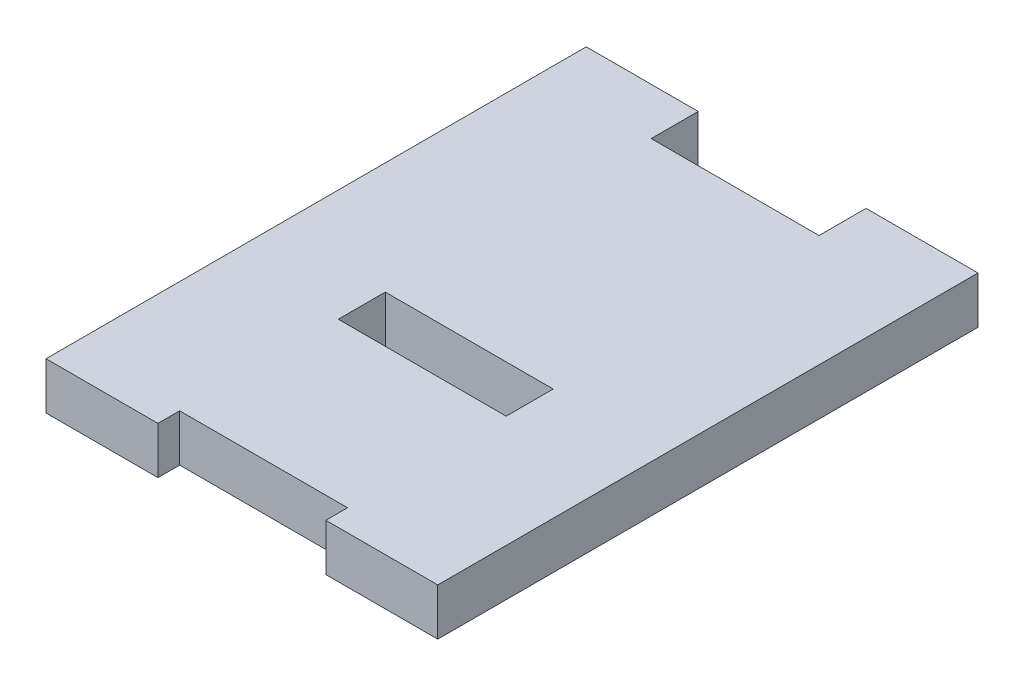
ISO-10303-21;
HEADER;
FILE_DESCRIPTION(('STEP AP214'),'2;1');
FILE_NAME('part.step','',(''),(''),'','','');
FILE_SCHEMA(('AUTOMOTIVE_DESIGN { 1 0 10303 214 1 1 1 1 }'));
ENDSEC;
DATA;
#1=APPLICATION_CONTEXT('core data for automotive mechanical design processes');
#2=APPLICATION_PROTOCOL_DEFINITION('international standard','automotive_design',2000,#1);
#3=PRODUCT_CONTEXT('',#1,'mechanical');
#4=PRODUCT('Part','Part','',(#3));
#5=PRODUCT_RELATED_PRODUCT_CATEGORY('part','',(#4));
#6=PRODUCT_DEFINITION_FORMATION('','',#4);
#7=PRODUCT_DEFINITION_CONTEXT('part definition',#1,'design');
#8=PRODUCT_DEFINITION('design','',#6,#7);
#9=PRODUCT_DEFINITION_SHAPE('','',#8);
#10=(LENGTH_UNIT() NAMED_UNIT(*) SI_UNIT(.MILLI.,.METRE.));
#11=(NAMED_UNIT(*) PLANE_ANGLE_UNIT() SI_UNIT($,.RADIAN.));
#12=(NAMED_UNIT(*) SI_UNIT($,.STERADIAN.) SOLID_ANGLE_UNIT());
#13=UNCERTAINTY_MEASURE_WITH_UNIT(LENGTH_MEASURE(1.E-05),#10,'distance_accuracy_value','');
#14=(GEOMETRIC_REPRESENTATION_CONTEXT(3) GLOBAL_UNCERTAINTY_ASSIGNED_CONTEXT((#13)) GLOBAL_UNIT_ASSIGNED_CONTEXT((#10,
#11,#12)) REPRESENTATION_CONTEXT('',''));
#15=CARTESIAN_POINT('',(0.,0.,0.));
#16=DIRECTION('',(0.,0.,1.));
#17=DIRECTION('',(1.,0.,0.));
#18=AXIS2_PLACEMENT_3D('',#15,#16,#17);
#19=CARTESIAN_POINT('',(0.,5.334,-61.300000082));
#20=DIRECTION('',(0.,0.,1.));
#21=DIRECTION('',(1.,0.,0.));
#22=AXIS2_PLACEMENT_3D('',#19,#20,#21);
#23=PLANE('',#22);
#24=DIRECTION('',(-1.,0.,0.));
#25=VECTOR('',#24,1.);
#26=CARTESIAN_POINT('',(0.,5.334,-61.300000082));
#27=LINE('',#26,#25);
#28=CARTESIAN_POINT('',(12.7,5.334,-61.300000082));
#29=VERTEX_POINT('',#28);
#30=CARTESIAN_POINT('',(0.,5.334,-61.300000082));
#31=VERTEX_POINT('',#30);
#32=EDGE_CURVE('E248',#29,#31,#27,.T.);
#33=ORIENTED_EDGE('',*,*,#32,.F.);
#34=DIRECTION('',(0.,1.,0.));
#35=VECTOR('',#34,1.);
#36=CARTESIAN_POINT('',(12.7,0.,-61.300000082));
#37=LINE('',#36,#35);
#38=CARTESIAN_POINT('',(12.7,0.,-61.300000082));
#39=VERTEX_POINT('',#38);
#40=EDGE_CURVE('E175',#39,#29,#37,.T.);
#41=ORIENTED_EDGE('',*,*,#40,.F.);
#42=DIRECTION('',(-1.,0.,0.));
#43=VECTOR('',#42,1.);
#44=CARTESIAN_POINT('',(0.,0.,-61.300000082));
#45=LINE('',#44,#43);
#46=CARTESIAN_POINT('',(0.,0.,-61.300000082));
#47=VERTEX_POINT('',#46);
#48=EDGE_CURVE('E166',#39,#47,#45,.T.);
#49=ORIENTED_EDGE('',*,*,#48,.T.);
#50=DIRECTION('',(0.,-1.,0.));
#51=VECTOR('',#50,1.);
#52=CARTESIAN_POINT('',(0.,5.334,-61.300000082));
#53=LINE('',#52,#51);
#54=EDGE_CURVE('E252',#31,#47,#53,.T.);
#55=ORIENTED_EDGE('',*,*,#54,.F.);
#56=EDGE_LOOP('',(#33,#41,#49,#55));
#57=FACE_BOUND('',#56,.T.);
#58=ADVANCED_FACE('F32',(#57),#23,.F.);
#59=CARTESIAN_POINT('',(0.,5.334,0.));
#60=DIRECTION('',(0.,0.,-1.));
#61=DIRECTION('',(-1.,0.,0.));
#62=AXIS2_PLACEMENT_3D('',#59,#60,#61);
#63=PLANE('',#62);
#64=DIRECTION('',(1.,0.,0.));
#65=VECTOR('',#64,1.);
#66=CARTESIAN_POINT('',(0.,0.,0.));
#67=LINE('',#66,#65);
#68=CARTESIAN_POINT('',(0.,0.,0.));
#69=VERTEX_POINT('',#68);
#70=CARTESIAN_POINT('',(12.7,0.,0.));
#71=VERTEX_POINT('',#70);
#72=EDGE_CURVE('E256',#69,#71,#67,.T.);
#73=ORIENTED_EDGE('',*,*,#72,.T.);
#74=DIRECTION('',(0.,1.,0.));
#75=VECTOR('',#74,1.);
#76=CARTESIAN_POINT('',(12.7,0.,0.));
#77=LINE('',#76,#75);
#78=CARTESIAN_POINT('',(12.7,5.334,0.));
#79=VERTEX_POINT('',#78);
#80=EDGE_CURVE('E222',#71,#79,#77,.T.);
#81=ORIENTED_EDGE('',*,*,#80,.T.);
#82=DIRECTION('',(1.,0.,0.));
#83=VECTOR('',#82,1.);
#84=CARTESIAN_POINT('',(0.,5.334,0.));
#85=LINE('',#84,#83);
#86=CARTESIAN_POINT('',(0.,5.334,0.));
#87=VERTEX_POINT('',#86);
#88=EDGE_CURVE('E243',#87,#79,#85,.T.);
#89=ORIENTED_EDGE('',*,*,#88,.F.);
#90=DIRECTION('',(0.,-1.,0.));
#91=VECTOR('',#90,1.);
#92=CARTESIAN_POINT('',(0.,5.334,0.));
#93=LINE('',#92,#91);
#94=EDGE_CURVE('E11',#87,#69,#93,.T.);
#95=ORIENTED_EDGE('',*,*,#94,.T.);
#96=EDGE_LOOP('',(#73,#81,#89,#95));
#97=FACE_BOUND('',#96,.T.);
#98=ADVANCED_FACE('F298',(#97),#63,.F.);
#99=CARTESIAN_POINT('',(0.,5.334,0.));
#100=DIRECTION('',(1.,0.,0.));
#101=DIRECTION('',(0.,0.,-1.));
#102=AXIS2_PLACEMENT_3D('',#99,#100,#101);
#103=PLANE('',#102);
#104=DIRECTION('',(0.,0.,1.));
#105=VECTOR('',#104,1.);
#106=CARTESIAN_POINT('',(0.,0.,0.));
#107=LINE('',#106,#105);
#108=EDGE_CURVE('E231',#47,#69,#107,.T.);
#109=ORIENTED_EDGE('',*,*,#108,.T.);
#110=ORIENTED_EDGE('',*,*,#94,.F.);
#111=DIRECTION('',(0.,0.,1.));
#112=VECTOR('',#111,1.);
#113=CARTESIAN_POINT('',(0.,5.334,0.));
#114=LINE('',#113,#112);
#115=EDGE_CURVE('E238',#31,#87,#114,.T.);
#116=ORIENTED_EDGE('',*,*,#115,.F.);
#117=ORIENTED_EDGE('',*,*,#54,.T.);
#118=EDGE_LOOP('',(#109,#110,#116,#117));
#119=FACE_BOUND('',#118,.T.);
#120=ADVANCED_FACE('F34',(#119),#103,.F.);
#121=CARTESIAN_POINT('',(31.75,5.334,0.));
#122=VERTEX_POINT('',#121);
#123=CARTESIAN_POINT('',(44.45,5.334,0.));
#124=VERTEX_POINT('',#123);
#125=EDGE_CURVE('E241',#122,#124,#85,.T.);
#126=ORIENTED_EDGE('',*,*,#125,.F.);
#127=DIRECTION('',(0.,1.,0.));
#128=VECTOR('',#127,1.);
#129=CARTESIAN_POINT('',(31.75,0.,0.));
#130=LINE('',#129,#128);
#131=CARTESIAN_POINT('',(31.75,0.,0.));
#132=VERTEX_POINT('',#131);
#133=EDGE_CURVE('E234',#132,#122,#130,.T.);
#134=ORIENTED_EDGE('',*,*,#133,.F.);
#135=CARTESIAN_POINT('',(44.45,0.,0.));
#136=VERTEX_POINT('',#135);
#137=EDGE_CURVE('E255',#132,#136,#67,.T.);
#138=ORIENTED_EDGE('',*,*,#137,.T.);
#139=DIRECTION('',(0.,-1.,0.));
#140=VECTOR('',#139,1.);
#141=CARTESIAN_POINT('',(44.45,5.334,0.));
#142=LINE('',#141,#140);
#143=EDGE_CURVE('E40',#124,#136,#142,.T.);
#144=ORIENTED_EDGE('',*,*,#143,.F.);
#145=EDGE_LOOP('',(#126,#134,#138,#144));
#146=FACE_BOUND('',#145,.T.);
#147=ADVANCED_FACE('F287',(#146),#63,.F.);
#148=CARTESIAN_POINT('',(44.45,5.334,0.));
#149=DIRECTION('',(-1.,0.,0.));
#150=DIRECTION('',(0.,0.,1.));
#151=AXIS2_PLACEMENT_3D('',#148,#149,#150);
#152=PLANE('',#151);
#153=DIRECTION('',(0.,0.,-1.));
#154=VECTOR('',#153,1.);
#155=CARTESIAN_POINT('',(44.45,0.,0.));
#156=LINE('',#155,#154);
#157=CARTESIAN_POINT('',(44.45,0.,-61.300000082));
#158=VERTEX_POINT('',#157);
#159=EDGE_CURVE('E259',#136,#158,#156,.T.);
#160=ORIENTED_EDGE('',*,*,#159,.T.);
#161=DIRECTION('',(0.,-1.,0.));
#162=VECTOR('',#161,1.);
#163=CARTESIAN_POINT('',(44.45,5.334,-61.300000082));
#164=LINE('',#163,#162);
#165=CARTESIAN_POINT('',(44.45,5.334,-61.300000082));
#166=VERTEX_POINT('',#165);
#167=EDGE_CURVE('E265',#166,#158,#164,.T.);
#168=ORIENTED_EDGE('',*,*,#167,.F.);
#169=DIRECTION('',(0.,0.,-1.));
#170=VECTOR('',#169,1.);
#171=CARTESIAN_POINT('',(44.45,5.334,0.));
#172=LINE('',#171,#170);
#173=EDGE_CURVE('E246',#124,#166,#172,.T.);
#174=ORIENTED_EDGE('',*,*,#173,.F.);
#175=ORIENTED_EDGE('',*,*,#143,.T.);
#176=EDGE_LOOP('',(#160,#168,#174,#175));
#177=FACE_BOUND('',#176,.T.);
#178=ADVANCED_FACE('F272',(#177),#152,.F.);
#179=CARTESIAN_POINT('',(31.75,0.,-61.300000082));
#180=VERTEX_POINT('',#179);
#181=EDGE_CURVE('E242',#158,#180,#45,.T.);
#182=ORIENTED_EDGE('',*,*,#181,.T.);
#183=DIRECTION('',(0.,1.,0.));
#184=VECTOR('',#183,1.);
#185=CARTESIAN_POINT('',(31.75,0.,-61.300000082));
#186=LINE('',#185,#184);
#187=CARTESIAN_POINT('',(31.75,5.334,-61.300000082));
#188=VERTEX_POINT('',#187);
#189=EDGE_CURVE('E177',#180,#188,#186,.T.);
#190=ORIENTED_EDGE('',*,*,#189,.T.);
#191=EDGE_CURVE('E249',#166,#188,#27,.T.);
#192=ORIENTED_EDGE('',*,*,#191,.F.);
#193=ORIENTED_EDGE('',*,*,#167,.T.);
#194=EDGE_LOOP('',(#182,#190,#192,#193));
#195=FACE_BOUND('',#194,.T.);
#196=ADVANCED_FACE('F279',(#195),#23,.F.);
#197=CARTESIAN_POINT('',(0.,5.334,0.));
#198=DIRECTION('',(0.,-1.,0.));
#199=DIRECTION('',(0.,0.,-1.));
#200=AXIS2_PLACEMENT_3D('',#197,#198,#199);
#201=PLANE('',#200);
#202=DIRECTION('',(1.,0.,0.));
#203=VECTOR('',#202,1.);
#204=CARTESIAN_POINT('',(12.7,5.334,-20.4638));
#205=LINE('',#204,#203);
#206=CARTESIAN_POINT('',(12.7,5.334,-20.4638));
#207=VERTEX_POINT('',#206);
#208=CARTESIAN_POINT('',(31.75,5.334,-20.4638));
#209=VERTEX_POINT('',#208);
#210=EDGE_CURVE('E196',#207,#209,#205,.T.);
#211=ORIENTED_EDGE('',*,*,#210,.F.);
#212=DIRECTION('',(0.,0.,1.));
#213=VECTOR('',#212,1.);
#214=CARTESIAN_POINT('',(12.7,5.334,-25.7978));
#215=LINE('',#214,#213);
#216=CARTESIAN_POINT('',(12.7,5.334,-25.7978));
#217=VERTEX_POINT('',#216);
#218=EDGE_CURVE('E55',#217,#207,#215,.T.);
#219=ORIENTED_EDGE('',*,*,#218,.F.);
#220=DIRECTION('',(-1.,0.,0.));
#221=VECTOR('',#220,1.);
#222=CARTESIAN_POINT('',(12.7,5.334,-25.7978));
#223=LINE('',#222,#221);
#224=CARTESIAN_POINT('',(31.75,5.334,-25.7978));
#225=VERTEX_POINT('',#224);
#226=EDGE_CURVE('E185',#225,#217,#223,.T.);
#227=ORIENTED_EDGE('',*,*,#226,.F.);
#228=DIRECTION('',(0.,0.,-1.));
#229=VECTOR('',#228,1.);
#230=CARTESIAN_POINT('',(31.75,5.334,-25.7978));
#231=LINE('',#230,#229);
#232=EDGE_CURVE('E199',#209,#225,#231,.T.);
#233=ORIENTED_EDGE('',*,*,#232,.F.);
#234=EDGE_LOOP('',(#211,#219,#227,#233));
#235=FACE_BOUND('',#234,.T.);
#236=DIRECTION('',(1.,0.,0.));
#237=VECTOR('',#236,1.);
#238=CARTESIAN_POINT('',(12.7,5.334,-55.966000082));
#239=LINE('',#238,#237);
#240=CARTESIAN_POINT('',(12.7,5.334,-55.966000082));
#241=VERTEX_POINT('',#240);
#242=CARTESIAN_POINT('',(31.75,5.334,-55.966000082));
#243=VERTEX_POINT('',#242);
#244=EDGE_CURVE('E169',#241,#243,#239,.T.);
#245=ORIENTED_EDGE('',*,*,#244,.F.);
#246=DIRECTION('',(0.,0.,1.));
#247=VECTOR('',#246,1.);
#248=CARTESIAN_POINT('',(12.7,5.334,-61.300000082));
#249=LINE('',#248,#247);
#250=EDGE_CURVE('E151',#29,#241,#249,.T.);
#251=ORIENTED_EDGE('',*,*,#250,.F.);
#252=ORIENTED_EDGE('',*,*,#32,.T.);
#253=ORIENTED_EDGE('',*,*,#115,.T.);
#254=ORIENTED_EDGE('',*,*,#88,.T.);
#255=DIRECTION('',(0.,0.,1.));
#256=VECTOR('',#255,1.);
#257=CARTESIAN_POINT('',(12.7,5.334,0.));
#258=LINE('',#257,#256);
#259=CARTESIAN_POINT('',(12.7,5.334,-2.4638));
#260=VERTEX_POINT('',#259);
#261=EDGE_CURVE('E206',#260,#79,#258,.T.);
#262=ORIENTED_EDGE('',*,*,#261,.F.);
#263=DIRECTION('',(-1.,0.,0.));
#264=VECTOR('',#263,1.);
#265=CARTESIAN_POINT('',(12.7,5.334,-2.4638));
#266=LINE('',#265,#264);
#267=CARTESIAN_POINT('',(31.75,5.334,-2.4638));
#268=VERTEX_POINT('',#267);
#269=EDGE_CURVE('E216',#268,#260,#266,.T.);
#270=ORIENTED_EDGE('',*,*,#269,.F.);
#271=DIRECTION('',(0.,0.,-1.));
#272=VECTOR('',#271,1.);
#273=CARTESIAN_POINT('',(31.75,5.334,0.));
#274=LINE('',#273,#272);
#275=EDGE_CURVE('E224',#122,#268,#274,.T.);
#276=ORIENTED_EDGE('',*,*,#275,.F.);
#277=ORIENTED_EDGE('',*,*,#125,.T.);
#278=ORIENTED_EDGE('',*,*,#173,.T.);
#279=ORIENTED_EDGE('',*,*,#191,.T.);
#280=DIRECTION('',(0.,0.,-1.));
#281=VECTOR('',#280,1.);
#282=CARTESIAN_POINT('',(31.75,5.334,-61.300000082));
#283=LINE('',#282,#281);
#284=EDGE_CURVE('E167',#243,#188,#283,.T.);
#285=ORIENTED_EDGE('',*,*,#284,.F.);
#286=EDGE_LOOP('',(#245,#251,#252,#253,#254,#262,#270,#276,#277,#278,#279,#285));
#287=FACE_BOUND('',#286,.T.);
#288=ADVANCED_FACE('F283',(#235,#287),#201,.F.);
#289=CARTESIAN_POINT('',(0.,0.,0.));
#290=DIRECTION('',(0.,-1.,0.));
#291=DIRECTION('',(0.,0.,-1.));
#292=AXIS2_PLACEMENT_3D('',#289,#290,#291);
#293=PLANE('',#292);
#294=DIRECTION('',(0.,0.,1.));
#295=VECTOR('',#294,1.);
#296=CARTESIAN_POINT('',(12.7,0.,-61.300000082));
#297=LINE('',#296,#295);
#298=CARTESIAN_POINT('',(12.7,0.,-55.966000082));
#299=VERTEX_POINT('',#298);
#300=EDGE_CURVE('E148',#39,#299,#297,.T.);
#301=ORIENTED_EDGE('',*,*,#300,.T.);
#302=DIRECTION('',(1.,0.,0.));
#303=VECTOR('',#302,1.);
#304=CARTESIAN_POINT('',(12.7,0.,-55.966000082));
#305=LINE('',#304,#303);
#306=CARTESIAN_POINT('',(31.75,0.,-55.966000082));
#307=VERTEX_POINT('',#306);
#308=EDGE_CURVE('E158',#299,#307,#305,.T.);
#309=ORIENTED_EDGE('',*,*,#308,.T.);
#310=DIRECTION('',(0.,0.,-1.));
#311=VECTOR('',#310,1.);
#312=CARTESIAN_POINT('',(31.75,0.,-61.300000082));
#313=LINE('',#312,#311);
#314=EDGE_CURVE('E47',#307,#180,#313,.T.);
#315=ORIENTED_EDGE('',*,*,#314,.T.);
#316=ORIENTED_EDGE('',*,*,#181,.F.);
#317=ORIENTED_EDGE('',*,*,#159,.F.);
#318=ORIENTED_EDGE('',*,*,#137,.F.);
#319=DIRECTION('',(0.,0.,-1.));
#320=VECTOR('',#319,1.);
#321=CARTESIAN_POINT('',(31.75,0.,0.));
#322=LINE('',#321,#320);
#323=CARTESIAN_POINT('',(31.75,0.,-2.4638));
#324=VERTEX_POINT('',#323);
#325=EDGE_CURVE('E215',#132,#324,#322,.T.);
#326=ORIENTED_EDGE('',*,*,#325,.T.);
#327=DIRECTION('',(-1.,0.,0.));
#328=VECTOR('',#327,1.);
#329=CARTESIAN_POINT('',(12.7,0.,-2.4638));
#330=LINE('',#329,#328);
#331=CARTESIAN_POINT('',(12.7,0.,-2.4638));
#332=VERTEX_POINT('',#331);
#333=EDGE_CURVE('E219',#324,#332,#330,.T.);
#334=ORIENTED_EDGE('',*,*,#333,.T.);
#335=DIRECTION('',(0.,0.,1.));
#336=VECTOR('',#335,1.);
#337=CARTESIAN_POINT('',(12.7,0.,0.));
#338=LINE('',#337,#336);
#339=EDGE_CURVE('E212',#332,#71,#338,.T.);
#340=ORIENTED_EDGE('',*,*,#339,.T.);
#341=ORIENTED_EDGE('',*,*,#72,.F.);
#342=ORIENTED_EDGE('',*,*,#108,.F.);
#343=ORIENTED_EDGE('',*,*,#48,.F.);
#344=EDGE_LOOP('',(#301,#309,#315,#316,#317,#318,#326,#334,#340,#341,#342,#343));
#345=FACE_BOUND('',#344,.T.);
#346=DIRECTION('',(0.,0.,1.));
#347=VECTOR('',#346,1.);
#348=CARTESIAN_POINT('',(12.7,0.,-25.7978));
#349=LINE('',#348,#347);
#350=CARTESIAN_POINT('',(12.7,0.,-25.7978));
#351=VERTEX_POINT('',#350);
#352=CARTESIAN_POINT('',(12.7,0.,-20.4638));
#353=VERTEX_POINT('',#352);
#354=EDGE_CURVE('E181',#351,#353,#349,.T.);
#355=ORIENTED_EDGE('',*,*,#354,.T.);
#356=DIRECTION('',(1.,0.,0.));
#357=VECTOR('',#356,1.);
#358=CARTESIAN_POINT('',(12.7,0.,-20.4638));
#359=LINE('',#358,#357);
#360=CARTESIAN_POINT('',(31.75,0.,-20.4638));
#361=VERTEX_POINT('',#360);
#362=EDGE_CURVE('E184',#353,#361,#359,.T.);
#363=ORIENTED_EDGE('',*,*,#362,.T.);
#364=DIRECTION('',(0.,0.,-1.));
#365=VECTOR('',#364,1.);
#366=CARTESIAN_POINT('',(31.75,0.,-25.7978));
#367=LINE('',#366,#365);
#368=CARTESIAN_POINT('',(31.75,0.,-25.7978));
#369=VERTEX_POINT('',#368);
#370=EDGE_CURVE('E188',#361,#369,#367,.T.);
#371=ORIENTED_EDGE('',*,*,#370,.T.);
#372=DIRECTION('',(-1.,0.,0.));
#373=VECTOR('',#372,1.);
#374=CARTESIAN_POINT('',(12.7,0.,-25.7978));
#375=LINE('',#374,#373);
#376=EDGE_CURVE('E191',#369,#351,#375,.T.);
#377=ORIENTED_EDGE('',*,*,#376,.T.);
#378=EDGE_LOOP('',(#355,#363,#371,#377));
#379=FACE_BOUND('',#378,.T.);
#380=ADVANCED_FACE('F163',(#345,#379),#293,.T.);
#381=CARTESIAN_POINT('',(12.7,0.,0.));
#382=DIRECTION('',(-1.,0.,0.));
#383=DIRECTION('',(0.,0.,1.));
#384=AXIS2_PLACEMENT_3D('',#381,#382,#383);
#385=PLANE('',#384);
#386=ORIENTED_EDGE('',*,*,#261,.T.);
#387=ORIENTED_EDGE('',*,*,#80,.F.);
#388=ORIENTED_EDGE('',*,*,#339,.F.);
#389=DIRECTION('',(0.,1.,0.));
#390=VECTOR('',#389,1.);
#391=CARTESIAN_POINT('',(12.7,0.,-2.4638));
#392=LINE('',#391,#390);
#393=EDGE_CURVE('E229',#332,#260,#392,.T.);
#394=ORIENTED_EDGE('',*,*,#393,.T.);
#395=EDGE_LOOP('',(#386,#387,#388,#394));
#396=FACE_BOUND('',#395,.T.);
#397=ADVANCED_FACE('F296',(#396),#385,.F.);
#398=CARTESIAN_POINT('',(12.7,0.,-2.4638));
#399=DIRECTION('',(0.,0.,-1.));
#400=DIRECTION('',(-1.,0.,0.));
#401=AXIS2_PLACEMENT_3D('',#398,#399,#400);
#402=PLANE('',#401);
#403=ORIENTED_EDGE('',*,*,#269,.T.);
#404=ORIENTED_EDGE('',*,*,#393,.F.);
#405=ORIENTED_EDGE('',*,*,#333,.F.);
#406=DIRECTION('',(0.,1.,0.));
#407=VECTOR('',#406,1.);
#408=CARTESIAN_POINT('',(31.75,0.,-2.4638));
#409=LINE('',#408,#407);
#410=EDGE_CURVE('E232',#324,#268,#409,.T.);
#411=ORIENTED_EDGE('',*,*,#410,.T.);
#412=EDGE_LOOP('',(#403,#404,#405,#411));
#413=FACE_BOUND('',#412,.T.);
#414=ADVANCED_FACE('F293',(#413),#402,.F.);
#415=CARTESIAN_POINT('',(31.75,0.,0.));
#416=DIRECTION('',(1.,0.,0.));
#417=DIRECTION('',(0.,0.,-1.));
#418=AXIS2_PLACEMENT_3D('',#415,#416,#417);
#419=PLANE('',#418);
#420=ORIENTED_EDGE('',*,*,#275,.T.);
#421=ORIENTED_EDGE('',*,*,#410,.F.);
#422=ORIENTED_EDGE('',*,*,#325,.F.);
#423=ORIENTED_EDGE('',*,*,#133,.T.);
#424=EDGE_LOOP('',(#420,#421,#422,#423));
#425=FACE_BOUND('',#424,.T.);
#426=ADVANCED_FACE('F289',(#425),#419,.F.);
#427=CARTESIAN_POINT('',(12.7,0.,-25.7978));
#428=DIRECTION('',(-1.,0.,0.));
#429=DIRECTION('',(0.,0.,1.));
#430=AXIS2_PLACEMENT_3D('',#427,#428,#429);
#431=PLANE('',#430);
#432=ORIENTED_EDGE('',*,*,#218,.T.);
#433=DIRECTION('',(0.,1.,0.));
#434=VECTOR('',#433,1.);
#435=CARTESIAN_POINT('',(12.7,0.,-20.4638));
#436=LINE('',#435,#434);
#437=EDGE_CURVE('E194',#353,#207,#436,.T.);
#438=ORIENTED_EDGE('',*,*,#437,.F.);
#439=ORIENTED_EDGE('',*,*,#354,.F.);
#440=DIRECTION('',(0.,1.,0.));
#441=VECTOR('',#440,1.);
#442=CARTESIAN_POINT('',(12.7,0.,-25.7978));
#443=LINE('',#442,#441);
#444=EDGE_CURVE('E204',#351,#217,#443,.T.);
#445=ORIENTED_EDGE('',*,*,#444,.T.);
#446=EDGE_LOOP('',(#432,#438,#439,#445));
#447=FACE_BOUND('',#446,.T.);
#448=ADVANCED_FACE('F384',(#447),#431,.F.);
#449=CARTESIAN_POINT('',(12.7,0.,-25.7978));
#450=DIRECTION('',(0.,0.,-1.));
#451=DIRECTION('',(-1.,0.,0.));
#452=AXIS2_PLACEMENT_3D('',#449,#450,#451);
#453=PLANE('',#452);
#454=ORIENTED_EDGE('',*,*,#226,.T.);
#455=ORIENTED_EDGE('',*,*,#444,.F.);
#456=ORIENTED_EDGE('',*,*,#376,.F.);
#457=DIRECTION('',(0.,1.,0.));
#458=VECTOR('',#457,1.);
#459=CARTESIAN_POINT('',(31.75,0.,-25.7978));
#460=LINE('',#459,#458);
#461=EDGE_CURVE('E207',#369,#225,#460,.T.);
#462=ORIENTED_EDGE('',*,*,#461,.T.);
#463=EDGE_LOOP('',(#454,#455,#456,#462));
#464=FACE_BOUND('',#463,.T.);
#465=ADVANCED_FACE('F392',(#464),#453,.F.);
#466=CARTESIAN_POINT('',(31.75,0.,-25.7978));
#467=DIRECTION('',(1.,0.,0.));
#468=DIRECTION('',(0.,0.,-1.));
#469=AXIS2_PLACEMENT_3D('',#466,#467,#468);
#470=PLANE('',#469);
#471=ORIENTED_EDGE('',*,*,#232,.T.);
#472=ORIENTED_EDGE('',*,*,#461,.F.);
#473=ORIENTED_EDGE('',*,*,#370,.F.);
#474=DIRECTION('',(0.,1.,0.));
#475=VECTOR('',#474,1.);
#476=CARTESIAN_POINT('',(31.75,0.,-20.4638));
#477=LINE('',#476,#475);
#478=EDGE_CURVE('E209',#361,#209,#477,.T.);
#479=ORIENTED_EDGE('',*,*,#478,.T.);
#480=EDGE_LOOP('',(#471,#472,#473,#479));
#481=FACE_BOUND('',#480,.T.);
#482=ADVANCED_FACE('F400',(#481),#470,.F.);
#483=CARTESIAN_POINT('',(12.7,0.,-20.4638));
#484=DIRECTION('',(0.,0.,1.));
#485=DIRECTION('',(1.,0.,0.));
#486=AXIS2_PLACEMENT_3D('',#483,#484,#485);
#487=PLANE('',#486);
#488=ORIENTED_EDGE('',*,*,#210,.T.);
#489=ORIENTED_EDGE('',*,*,#478,.F.);
#490=ORIENTED_EDGE('',*,*,#362,.F.);
#491=ORIENTED_EDGE('',*,*,#437,.T.);
#492=EDGE_LOOP('',(#488,#489,#490,#491));
#493=FACE_BOUND('',#492,.T.);
#494=ADVANCED_FACE('F409',(#493),#487,.F.);
#495=CARTESIAN_POINT('',(12.7,0.,-61.300000082));
#496=DIRECTION('',(-1.,0.,0.));
#497=DIRECTION('',(0.,0.,1.));
#498=AXIS2_PLACEMENT_3D('',#495,#496,#497);
#499=PLANE('',#498);
#500=ORIENTED_EDGE('',*,*,#250,.T.);
#501=DIRECTION('',(0.,1.,0.));
#502=VECTOR('',#501,1.);
#503=CARTESIAN_POINT('',(12.7,0.,-55.966000082));
#504=LINE('',#503,#502);
#505=EDGE_CURVE('E144',#299,#241,#504,.T.);
#506=ORIENTED_EDGE('',*,*,#505,.F.);
#507=ORIENTED_EDGE('',*,*,#300,.F.);
#508=ORIENTED_EDGE('',*,*,#40,.T.);
#509=EDGE_LOOP('',(#500,#506,#507,#508));
#510=FACE_BOUND('',#509,.T.);
#511=ADVANCED_FACE('F146',(#510),#499,.F.);
#512=CARTESIAN_POINT('',(31.75,0.,-61.300000082));
#513=DIRECTION('',(1.,0.,0.));
#514=DIRECTION('',(0.,0.,-1.));
#515=AXIS2_PLACEMENT_3D('',#512,#513,#514);
#516=PLANE('',#515);
#517=ORIENTED_EDGE('',*,*,#284,.T.);
#518=ORIENTED_EDGE('',*,*,#189,.F.);
#519=ORIENTED_EDGE('',*,*,#314,.F.);
#520=DIRECTION('',(0.,1.,0.));
#521=VECTOR('',#520,1.);
#522=CARTESIAN_POINT('',(31.75,0.,-55.966000082));
#523=LINE('',#522,#521);
#524=EDGE_CURVE('E155',#307,#243,#523,.T.);
#525=ORIENTED_EDGE('',*,*,#524,.T.);
#526=EDGE_LOOP('',(#517,#518,#519,#525));
#527=FACE_BOUND('',#526,.T.);
#528=ADVANCED_FACE('F426',(#527),#516,.F.);
#529=CARTESIAN_POINT('',(12.7,0.,-55.966000082));
#530=DIRECTION('',(0.,0.,1.));
#531=DIRECTION('',(1.,0.,0.));
#532=AXIS2_PLACEMENT_3D('',#529,#530,#531);
#533=PLANE('',#532);
#534=ORIENTED_EDGE('',*,*,#244,.T.);
#535=ORIENTED_EDGE('',*,*,#524,.F.);
#536=ORIENTED_EDGE('',*,*,#308,.F.);
#537=ORIENTED_EDGE('',*,*,#505,.T.);
#538=EDGE_LOOP('',(#534,#535,#536,#537));
#539=FACE_BOUND('',#538,.T.);
#540=ADVANCED_FACE('F159',(#539),#533,.F.);
#541=CLOSED_SHELL('',(#58,#98,#120,#147,#178,#196,#288,#380,#397,#414,#426,#448,#465,#482,#494,
#511,#528,#540));
#542=MANIFOLD_SOLID_BREP('B2',#541);
#543=ADVANCED_BREP_SHAPE_REPRESENTATION('',(#18,#542),#14);
#544=SHAPE_DEFINITION_REPRESENTATION(#9,#543);
ENDSEC;
END-ISO-10303-21;
